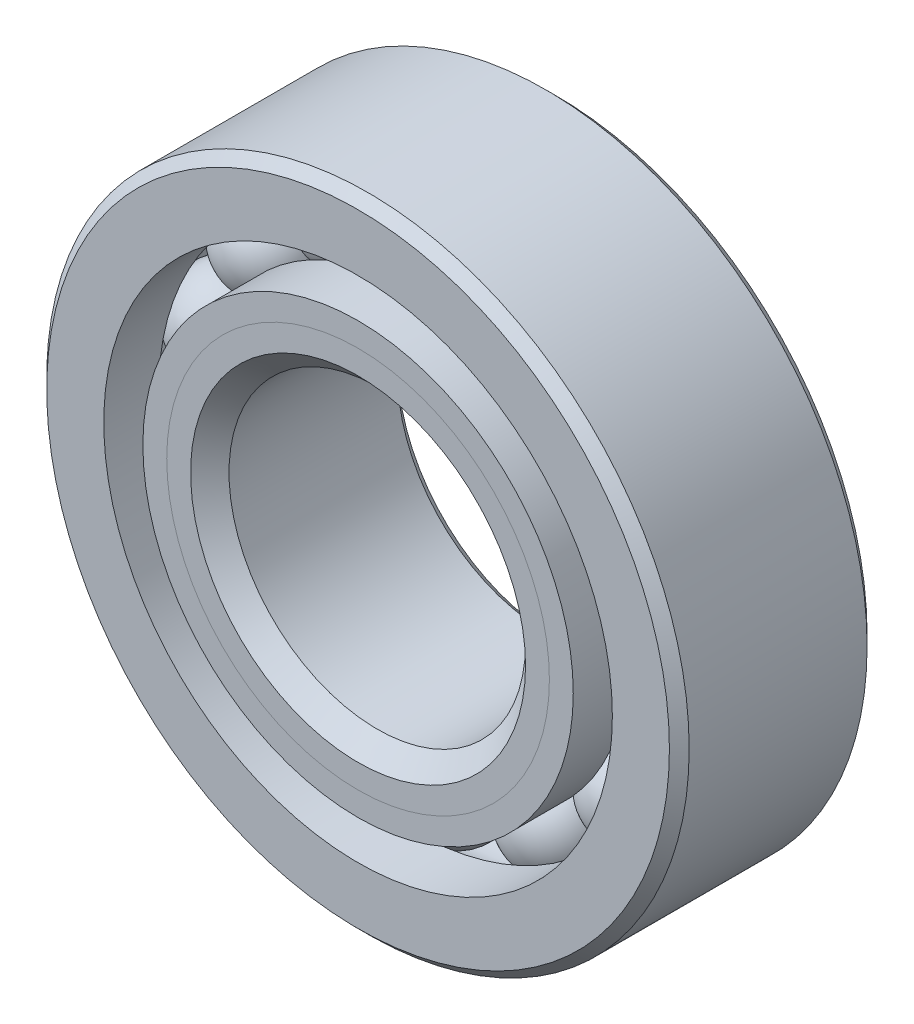
ISO-10303-21;
HEADER;
FILE_DESCRIPTION(('STEP AP214'),'2;1');
FILE_NAME('part.step','',(''),(''),'','','');
FILE_SCHEMA(('AUTOMOTIVE_DESIGN { 1 0 10303 214 1 1 1 1 }'));
ENDSEC;
DATA;
#1=APPLICATION_CONTEXT('core data for automotive mechanical design processes');
#2=APPLICATION_PROTOCOL_DEFINITION('international standard','automotive_design',2000,#1);
#3=PRODUCT_CONTEXT('',#1,'mechanical');
#4=PRODUCT('Part','Part','',(#3));
#5=PRODUCT_RELATED_PRODUCT_CATEGORY('part','',(#4));
#6=PRODUCT_DEFINITION_FORMATION('','',#4);
#7=PRODUCT_DEFINITION_CONTEXT('part definition',#1,'design');
#8=PRODUCT_DEFINITION('design','',#6,#7);
#9=PRODUCT_DEFINITION_SHAPE('','',#8);
#10=(LENGTH_UNIT() NAMED_UNIT(*) SI_UNIT(.MILLI.,.METRE.));
#11=(NAMED_UNIT(*) PLANE_ANGLE_UNIT() SI_UNIT($,.RADIAN.));
#12=(NAMED_UNIT(*) SI_UNIT($,.STERADIAN.) SOLID_ANGLE_UNIT());
#13=UNCERTAINTY_MEASURE_WITH_UNIT(LENGTH_MEASURE(1.E-05),#10,'distance_accuracy_value','');
#14=(GEOMETRIC_REPRESENTATION_CONTEXT(3) GLOBAL_UNCERTAINTY_ASSIGNED_CONTEXT((#13)) GLOBAL_UNIT_ASSIGNED_CONTEXT((#10,
#11,#12)) REPRESENTATION_CONTEXT('',''));
#15=CARTESIAN_POINT('',(0.,0.,0.));
#16=DIRECTION('',(0.,0.,1.));
#17=DIRECTION('',(1.,0.,0.));
#18=AXIS2_PLACEMENT_3D('',#15,#16,#17);
#19=CARTESIAN_POINT('',(-6.5435091405665,13.5877367390534,0.));
#20=DIRECTION('',(0.,0.,1.));
#21=DIRECTION('',(-0.433883739117546,0.900968867902425,0.));
#22=AXIS2_PLACEMENT_3D('',#19,#20,#21);
#23=SPHERICAL_SURFACE('',#22,3.08910742628344);
#24=CARTESIAN_POINT('',(-6.5435091405665,13.5877367390534,3.08910742628344));
#25=VERTEX_POINT('',#24);
#26=VERTEX_LOOP('',#25);
#27=FACE_BOUND('',#26,.T.);
#28=ADVANCED_FACE('F41',(#27),#23,.T.);
#29=CLOSED_SHELL('',(#28));
#30=MANIFOLD_SOLID_BREP('B2',#29);
#31=CARTESIAN_POINT('',(-11.7909960449709,9.40300557428217,0.));
#32=DIRECTION('',(0.,0.,1.));
#33=DIRECTION('',(-0.781831482468022,0.623489801858743,0.));
#34=AXIS2_PLACEMENT_3D('',#31,#32,#33);
#35=SPHERICAL_SURFACE('',#34,3.08910742628344);
#36=CARTESIAN_POINT('',(-11.7909960449709,9.40300557428217,3.08910742628344));
#37=VERTEX_POINT('',#36);
#38=VERTEX_LOOP('',#37);
#39=FACE_BOUND('',#38,.T.);
#40=ADVANCED_FACE('F62',(#39),#35,.T.);
#41=CLOSED_SHELL('',(#40));
#42=MANIFOLD_SOLID_BREP('B6',#41);
#43=CARTESIAN_POINT('',(-14.7031315755921,3.35589383522882,0.));
#44=DIRECTION('',(0.,0.,1.));
#45=DIRECTION('',(-0.974927912181821,0.222520933956325,0.));
#46=AXIS2_PLACEMENT_3D('',#43,#44,#45);
#47=SPHERICAL_SURFACE('',#46,3.08910742628344);
#48=CARTESIAN_POINT('',(-14.7031315755921,3.35589383522882,3.08910742628344));
#49=VERTEX_POINT('',#48);
#50=VERTEX_LOOP('',#49);
#51=FACE_BOUND('',#50,.T.);
#52=ADVANCED_FACE('F83',(#51),#47,.T.);
#53=CLOSED_SHELL('',(#52));
#54=MANIFOLD_SOLID_BREP('B37',#53);
#55=CARTESIAN_POINT('',(-14.7031315755922,-3.35589383522853,0.));
#56=DIRECTION('',(0.,0.,1.));
#57=DIRECTION('',(-0.974927912181826,-0.222520933956305,0.));
#58=AXIS2_PLACEMENT_3D('',#55,#56,#57);
#59=SPHERICAL_SURFACE('',#58,3.08910742628344);
#60=CARTESIAN_POINT('',(-14.7031315755922,-3.35589383522853,3.08910742628344));
#61=VERTEX_POINT('',#60);
#62=VERTEX_LOOP('',#61);
#63=FACE_BOUND('',#62,.T.);
#64=ADVANCED_FACE('F104',(#63),#59,.T.);
#65=CLOSED_SHELL('',(#64));
#66=MANIFOLD_SOLID_BREP('B58',#65);
#67=CARTESIAN_POINT('',(-11.7909960449711,-9.40300557428192,0.));
#68=DIRECTION('',(0.,0.,1.));
#69=DIRECTION('',(-0.781831482468035,-0.623489801858727,0.));
#70=AXIS2_PLACEMENT_3D('',#67,#68,#69);
#71=SPHERICAL_SURFACE('',#70,3.08910742628344);
#72=CARTESIAN_POINT('',(-11.7909960449711,-9.40300557428192,3.08910742628344));
#73=VERTEX_POINT('',#72);
#74=VERTEX_LOOP('',#73);
#75=FACE_BOUND('',#74,.T.);
#76=ADVANCED_FACE('F125',(#75),#71,.T.);
#77=CLOSED_SHELL('',(#76));
#78=MANIFOLD_SOLID_BREP('B79',#77);
#79=CARTESIAN_POINT('',(-6.54350914056678,-13.5877367390533,0.));
#80=DIRECTION('',(0.,0.,1.));
#81=DIRECTION('',(-0.433883739117565,-0.900968867902416,0.));
#82=AXIS2_PLACEMENT_3D('',#79,#80,#81);
#83=SPHERICAL_SURFACE('',#82,3.08910742628344);
#84=CARTESIAN_POINT('',(-6.54350914056678,-13.5877367390533,3.08910742628344));
#85=VERTEX_POINT('',#84);
#86=VERTEX_LOOP('',#85);
#87=FACE_BOUND('',#86,.T.);
#88=ADVANCED_FACE('F146',(#87),#83,.T.);
#89=CLOSED_SHELL('',(#88));
#90=MANIFOLD_SOLID_BREP('B100',#89);
#91=CARTESIAN_POINT('',(-1.05311866879462E-13,-15.08125,0.));
#92=DIRECTION('',(0.,0.,1.));
#93=DIRECTION('',(0.,-1.,0.));
#94=AXIS2_PLACEMENT_3D('',#91,#92,#93);
#95=SPHERICAL_SURFACE('',#94,3.08910742628344);
#96=CARTESIAN_POINT('',(-1.05311866879462E-13,-15.08125,3.08910742628344));
#97=VERTEX_POINT('',#96);
#98=VERTEX_LOOP('',#97);
#99=FACE_BOUND('',#98,.T.);
#100=ADVANCED_FACE('F167',(#99),#95,.T.);
#101=CLOSED_SHELL('',(#100));
#102=MANIFOLD_SOLID_BREP('B121',#101);
#103=CARTESIAN_POINT('',(6.54350914056659,-13.5877367390534,0.));
#104=DIRECTION('',(0.,0.,1.));
#105=DIRECTION('',(0.433883739117553,-0.900968867902422,0.));
#106=AXIS2_PLACEMENT_3D('',#103,#104,#105);
#107=SPHERICAL_SURFACE('',#106,3.08910742628344);
#108=CARTESIAN_POINT('',(6.54350914056659,-13.5877367390534,3.08910742628344));
#109=VERTEX_POINT('',#108);
#110=VERTEX_LOOP('',#109);
#111=FACE_BOUND('',#110,.T.);
#112=ADVANCED_FACE('F188',(#111),#107,.T.);
#113=CLOSED_SHELL('',(#112));
#114=MANIFOLD_SOLID_BREP('B142',#113);
#115=CARTESIAN_POINT('',(11.7909960449709,-9.40300557428208,0.));
#116=DIRECTION('',(0.,0.,1.));
#117=DIRECTION('',(0.781831482468027,-0.623489801858737,0.));
#118=AXIS2_PLACEMENT_3D('',#115,#116,#117);
#119=SPHERICAL_SURFACE('',#118,3.08910742628344);
#120=CARTESIAN_POINT('',(11.7909960449709,-9.40300557428208,3.08910742628344));
#121=VERTEX_POINT('',#120);
#122=VERTEX_LOOP('',#121);
#123=FACE_BOUND('',#122,.T.);
#124=ADVANCED_FACE('F209',(#123),#119,.T.);
#125=CLOSED_SHELL('',(#124));
#126=MANIFOLD_SOLID_BREP('B163',#125);
#127=CARTESIAN_POINT('',(14.7031315755921,-3.35589383522872,0.));
#128=DIRECTION('',(0.,0.,1.));
#129=DIRECTION('',(0.974927912181823,-0.222520933956318,0.));
#130=AXIS2_PLACEMENT_3D('',#127,#128,#129);
#131=SPHERICAL_SURFACE('',#130,3.08910742628344);
#132=CARTESIAN_POINT('',(14.7031315755921,-3.35589383522872,3.08910742628344));
#133=VERTEX_POINT('',#132);
#134=VERTEX_LOOP('',#133);
#135=FACE_BOUND('',#134,.T.);
#136=ADVANCED_FACE('F230',(#135),#131,.T.);
#137=CLOSED_SHELL('',(#136));
#138=MANIFOLD_SOLID_BREP('B184',#137);
#139=CARTESIAN_POINT('',(14.7031315755921,3.35589383522862,0.));
#140=DIRECTION('',(0.,0.,1.));
#141=DIRECTION('',(0.974927912181824,0.222520933956311,0.));
#142=AXIS2_PLACEMENT_3D('',#139,#140,#141);
#143=SPHERICAL_SURFACE('',#142,3.08910742628344);
#144=CARTESIAN_POINT('',(14.7031315755921,3.35589383522862,3.08910742628344));
#145=VERTEX_POINT('',#144);
#146=VERTEX_LOOP('',#145);
#147=FACE_BOUND('',#146,.T.);
#148=ADVANCED_FACE('F251',(#147),#143,.T.);
#149=CLOSED_SHELL('',(#148));
#150=MANIFOLD_SOLID_BREP('B205',#149);
#151=CARTESIAN_POINT('',(11.790996044971,9.403005574282,0.));
#152=DIRECTION('',(0.,0.,1.));
#153=DIRECTION('',(0.781831482468031,0.623489801858732,0.));
#154=AXIS2_PLACEMENT_3D('',#151,#152,#153);
#155=SPHERICAL_SURFACE('',#154,3.08910742628344);
#156=CARTESIAN_POINT('',(11.790996044971,9.403005574282,3.08910742628344));
#157=VERTEX_POINT('',#156);
#158=VERTEX_LOOP('',#157);
#159=FACE_BOUND('',#158,.T.);
#160=ADVANCED_FACE('F272',(#159),#155,.T.);
#161=CLOSED_SHELL('',(#160));
#162=MANIFOLD_SOLID_BREP('B226',#161);
#163=CARTESIAN_POINT('',(6.54350914056669,13.5877367390534,0.));
#164=DIRECTION('',(0.,0.,1.));
#165=DIRECTION('',(0.433883739117559,0.900968867902419,0.));
#166=AXIS2_PLACEMENT_3D('',#163,#164,#165);
#167=SPHERICAL_SURFACE('',#166,3.08910742628344);
#168=CARTESIAN_POINT('',(6.54350914056669,13.5877367390534,3.08910742628344));
#169=VERTEX_POINT('',#168);
#170=VERTEX_LOOP('',#169);
#171=FACE_BOUND('',#170,.T.);
#172=ADVANCED_FACE('F293',(#171),#167,.T.);
#173=CLOSED_SHELL('',(#172));
#174=MANIFOLD_SOLID_BREP('B247',#173);
#175=CARTESIAN_POINT('',(0.,15.08125,0.));
#176=DIRECTION('',(0.,0.,1.));
#177=DIRECTION('',(0.,1.,0.));
#178=AXIS2_PLACEMENT_3D('',#175,#176,#177);
#179=SPHERICAL_SURFACE('',#178,3.08910742628344);
#180=CARTESIAN_POINT('',(0.,15.08125,3.08910742628344));
#181=VERTEX_POINT('',#180);
#182=VERTEX_LOOP('',#181);
#183=FACE_BOUND('',#182,.T.);
#184=ADVANCED_FACE('F315',(#183),#179,.T.);
#185=CLOSED_SHELL('',(#184));
#186=MANIFOLD_SOLID_BREP('B268',#185);
#187=CARTESIAN_POINT('',(0.,12.2918886654072,6.35));
#188=DIRECTION('',(0.,0.,-1.));
#189=DIRECTION('',(-1.,0.,0.));
#190=AXIS2_PLACEMENT_3D('',#187,#188,#189);
#191=PLANE('',#190);
#192=CARTESIAN_POINT('',(0.,0.,6.35));
#193=DIRECTION('',(0.,0.,1.));
#194=DIRECTION('',(1.,0.,0.));
#195=AXIS2_PLACEMENT_3D('',#192,#193,#194);
#196=CIRCLE('',#195,10.7585712868583);
#197=CARTESIAN_POINT('',(10.7585712868583,0.,6.35));
#198=VERTEX_POINT('',#197);
#199=EDGE_CURVE('E370',#198,#198,#196,.T.);
#200=ORIENTED_EDGE('',*,*,#199,.F.);
#201=EDGE_LOOP('',(#200));
#202=FACE_BOUND('',#201,.T.);
#203=CARTESIAN_POINT('',(0.,0.,6.35));
#204=DIRECTION('',(0.,0.,1.));
#205=DIRECTION('',(1.,0.,0.));
#206=AXIS2_PLACEMENT_3D('',#203,#204,#205);
#207=CIRCLE('',#206,12.2918886654072);
#208=CARTESIAN_POINT('',(12.2918886654072,0.,6.35));
#209=VERTEX_POINT('',#208);
#210=EDGE_CURVE('E314',#209,#209,#207,.T.);
#211=ORIENTED_EDGE('',*,*,#210,.T.);
#212=EDGE_LOOP('',(#211));
#213=FACE_BOUND('',#212,.T.);
#214=ADVANCED_FACE('F336',(#202,#213),#191,.F.);
#215=CARTESIAN_POINT('',(0.,0.,4.81668262145113));
#216=DIRECTION('',(0.,0.,1.));
#217=DIRECTION('',(1.,0.,0.));
#218=AXIS2_PLACEMENT_3D('',#215,#216,#217);
#219=CONICAL_SURFACE('',#218,10.7585712868583,0.785398163397451);
#220=ORIENTED_EDGE('',*,*,#210,.F.);
#221=EDGE_LOOP('',(#220));
#222=FACE_BOUND('',#221,.T.);
#223=CARTESIAN_POINT('',(0.,0.,4.81668262145113));
#224=DIRECTION('',(0.,0.,1.));
#225=DIRECTION('',(1.,0.,0.));
#226=AXIS2_PLACEMENT_3D('',#223,#224,#225);
#227=CIRCLE('',#226,10.7585712868583);
#228=CARTESIAN_POINT('',(10.7585712868583,0.,4.81668262145113));
#229=VERTEX_POINT('',#228);
#230=EDGE_CURVE('E342',#229,#229,#227,.T.);
#231=ORIENTED_EDGE('',*,*,#230,.T.);
#232=EDGE_LOOP('',(#231));
#233=FACE_BOUND('',#232,.T.);
#234=ADVANCED_FACE('F377',(#222,#233),#219,.T.);
#235=CARTESIAN_POINT('',(0.,0.,6.35));
#236=DIRECTION('',(0.,0.,1.));
#237=DIRECTION('',(1.,0.,0.));
#238=AXIS2_PLACEMENT_3D('',#235,#236,#237);
#239=CYLINDRICAL_SURFACE('',#238,10.7585712868583);
#240=ORIENTED_EDGE('',*,*,#230,.F.);
#241=EDGE_LOOP('',(#240));
#242=FACE_BOUND('',#241,.T.);
#243=CARTESIAN_POINT('',(0.,0.,0.));
#244=DIRECTION('',(0.,0.,1.));
#245=DIRECTION('',(1.,0.,0.));
#246=AXIS2_PLACEMENT_3D('',#243,#244,#245);
#247=CIRCLE('',#246,10.7585712868583);
#248=CARTESIAN_POINT('',(10.7585712868583,0.,0.));
#249=VERTEX_POINT('',#248);
#250=EDGE_CURVE('E346',#249,#249,#247,.T.);
#251=ORIENTED_EDGE('',*,*,#250,.T.);
#252=EDGE_LOOP('',(#251));
#253=FACE_BOUND('',#252,.T.);
#254=ADVANCED_FACE('F381',(#242,#253),#239,.T.);
#255=CARTESIAN_POINT('',(0.,10.7585712868583,0.));
#256=DIRECTION('',(0.,0.,-1.));
#257=DIRECTION('',(-1.,0.,0.));
#258=AXIS2_PLACEMENT_3D('',#255,#256,#257);
#259=PLANE('',#258);
#260=ORIENTED_EDGE('',*,*,#250,.F.);
#261=EDGE_LOOP('',(#260));
#262=FACE_BOUND('',#261,.T.);
#263=CARTESIAN_POINT('',(0.,0.,0.));
#264=DIRECTION('',(0.,0.,1.));
#265=DIRECTION('',(1.,0.,0.));
#266=AXIS2_PLACEMENT_3D('',#263,#264,#265);
#267=CIRCLE('',#266,11.9921425737166);
#268=CARTESIAN_POINT('',(11.9921425737166,0.,0.));
#269=VERTEX_POINT('',#268);
#270=EDGE_CURVE('E350',#269,#269,#267,.T.);
#271=ORIENTED_EDGE('',*,*,#270,.T.);
#272=EDGE_LOOP('',(#271));
#273=FACE_BOUND('',#272,.T.);
#274=ADVANCED_FACE('F386',(#262,#273),#259,.F.);
#275=CARTESIAN_POINT('',(0.,0.,0.));
#276=DIRECTION('',(0.,0.,1.));
#277=DIRECTION('',(1.,0.,0.));
#278=AXIS2_PLACEMENT_3D('',#275,#276,#277);
#279=TOROIDAL_SURFACE('',#278,15.08125,3.08910742628344);
#280=ORIENTED_EDGE('',*,*,#270,.F.);
#281=EDGE_LOOP('',(#280));
#282=FACE_BOUND('',#281,.T.);
#283=CARTESIAN_POINT('',(0.,0.,-2.82222222222222));
#284=DIRECTION('',(0.,0.,1.));
#285=DIRECTION('',(1.,0.,0.));
#286=AXIS2_PLACEMENT_3D('',#283,#284,#285);
#287=CIRCLE('',#286,13.825206043956);
#288=CARTESIAN_POINT('',(13.825206043956,0.,-2.82222222222222));
#289=VERTEX_POINT('',#288);
#290=EDGE_CURVE('E355',#289,#289,#287,.T.);
#291=ORIENTED_EDGE('',*,*,#290,.T.);
#292=EDGE_LOOP('',(#291));
#293=FACE_BOUND('',#292,.T.);
#294=ADVANCED_FACE('F392',(#282,#293),#279,.F.);
#295=CARTESIAN_POINT('',(0.,0.,6.35));
#296=DIRECTION('',(0.,0.,1.));
#297=DIRECTION('',(1.,0.,0.));
#298=AXIS2_PLACEMENT_3D('',#295,#296,#297);
#299=CYLINDRICAL_SURFACE('',#298,13.825206043956);
#300=ORIENTED_EDGE('',*,*,#290,.F.);
#301=EDGE_LOOP('',(#300));
#302=FACE_BOUND('',#301,.T.);
#303=CARTESIAN_POINT('',(0.,0.,-6.35));
#304=DIRECTION('',(0.,0.,1.));
#305=DIRECTION('',(1.,0.,0.));
#306=AXIS2_PLACEMENT_3D('',#303,#304,#305);
#307=CIRCLE('',#306,13.825206043956);
#308=CARTESIAN_POINT('',(13.825206043956,0.,-6.35));
#309=VERTEX_POINT('',#308);
#310=EDGE_CURVE('E358',#309,#309,#307,.T.);
#311=ORIENTED_EDGE('',*,*,#310,.T.);
#312=EDGE_LOOP('',(#311));
#313=FACE_BOUND('',#312,.T.);
#314=ADVANCED_FACE('F396',(#302,#313),#299,.T.);
#315=CARTESIAN_POINT('',(0.,10.16,-6.35));
#316=DIRECTION('',(0.,0.,1.));
#317=DIRECTION('',(1.,0.,0.));
#318=AXIS2_PLACEMENT_3D('',#315,#316,#317);
#319=PLANE('',#318);
#320=ORIENTED_EDGE('',*,*,#310,.F.);
#321=EDGE_LOOP('',(#320));
#322=FACE_BOUND('',#321,.T.);
#323=CARTESIAN_POINT('',(0.,0.,-6.35));
#324=DIRECTION('',(0.,0.,1.));
#325=DIRECTION('',(1.,0.,0.));
#326=AXIS2_PLACEMENT_3D('',#323,#324,#325);
#327=CIRCLE('',#326,10.16);
#328=CARTESIAN_POINT('',(10.16,0.,-6.35));
#329=VERTEX_POINT('',#328);
#330=EDGE_CURVE('E361',#329,#329,#327,.T.);
#331=ORIENTED_EDGE('',*,*,#330,.T.);
#332=EDGE_LOOP('',(#331));
#333=FACE_BOUND('',#332,.T.);
#334=ADVANCED_FACE('F400',(#322,#333),#319,.F.);
#335=CARTESIAN_POINT('',(0.,0.,-5.715));
#336=DIRECTION('',(0.,0.,-1.));
#337=DIRECTION('',(-1.,0.,0.));
#338=AXIS2_PLACEMENT_3D('',#335,#336,#337);
#339=CONICAL_SURFACE('',#338,9.525,0.78539816339745);
#340=ORIENTED_EDGE('',*,*,#330,.F.);
#341=EDGE_LOOP('',(#340));
#342=FACE_BOUND('',#341,.T.);
#343=CARTESIAN_POINT('',(0.,0.,-5.715));
#344=DIRECTION('',(0.,0.,1.));
#345=DIRECTION('',(1.,0.,0.));
#346=AXIS2_PLACEMENT_3D('',#343,#344,#345);
#347=CIRCLE('',#346,9.525);
#348=CARTESIAN_POINT('',(9.525,0.,-5.715));
#349=VERTEX_POINT('',#348);
#350=EDGE_CURVE('E364',#349,#349,#347,.T.);
#351=ORIENTED_EDGE('',*,*,#350,.T.);
#352=EDGE_LOOP('',(#351));
#353=FACE_BOUND('',#352,.T.);
#354=ADVANCED_FACE('F404',(#342,#353),#339,.F.);
#355=CARTESIAN_POINT('',(0.,0.,6.35));
#356=DIRECTION('',(0.,0.,1.));
#357=DIRECTION('',(1.,0.,0.));
#358=AXIS2_PLACEMENT_3D('',#355,#356,#357);
#359=CYLINDRICAL_SURFACE('',#358,9.525);
#360=ORIENTED_EDGE('',*,*,#350,.F.);
#361=EDGE_LOOP('',(#360));
#362=FACE_BOUND('',#361,.T.);
#363=CARTESIAN_POINT('',(0.,0.,5.11642871314173));
#364=DIRECTION('',(0.,0.,1.));
#365=DIRECTION('',(1.,0.,0.));
#366=AXIS2_PLACEMENT_3D('',#363,#364,#365);
#367=CIRCLE('',#366,9.525);
#368=CARTESIAN_POINT('',(9.525,0.,5.11642871314173));
#369=VERTEX_POINT('',#368);
#370=EDGE_CURVE('E367',#369,#369,#367,.T.);
#371=ORIENTED_EDGE('',*,*,#370,.T.);
#372=EDGE_LOOP('',(#371));
#373=FACE_BOUND('',#372,.T.);
#374=ADVANCED_FACE('F408',(#362,#373),#359,.F.);
#375=CARTESIAN_POINT('',(0.,0.,6.35));
#376=DIRECTION('',(0.,0.,1.));
#377=DIRECTION('',(1.,0.,0.));
#378=AXIS2_PLACEMENT_3D('',#375,#376,#377);
#379=CONICAL_SURFACE('',#378,10.7585712868583,0.78539816339745);
#380=ORIENTED_EDGE('',*,*,#370,.F.);
#381=EDGE_LOOP('',(#380));
#382=FACE_BOUND('',#381,.T.);
#383=ORIENTED_EDGE('',*,*,#199,.T.);
#384=EDGE_LOOP('',(#383));
#385=FACE_BOUND('',#384,.T.);
#386=ADVANCED_FACE('F374',(#382,#385),#379,.F.);
#387=CLOSED_SHELL('',(#214,#234,#254,#274,#294,#314,#334,#354,#374,#386));
#388=MANIFOLD_SOLID_BREP('B289',#387);
#389=CARTESIAN_POINT('',(0.,13.825206043956,6.35));
#390=DIRECTION('',(0.,0.,-1.));
#391=DIRECTION('',(-1.,0.,0.));
#392=AXIS2_PLACEMENT_3D('',#389,#390,#391);
#393=PLANE('',#392);
#394=CARTESIAN_POINT('',(0.,0.,6.35));
#395=DIRECTION('',(0.,0.,1.));
#396=DIRECTION('',(1.,0.,0.));
#397=AXIS2_PLACEMENT_3D('',#394,#395,#396);
#398=CIRCLE('',#397,12.2918886654072);
#399=CARTESIAN_POINT('',(12.2918886654072,0.,6.35));
#400=VERTEX_POINT('',#399);
#401=EDGE_CURVE('E335',#400,#400,#398,.T.);
#402=ORIENTED_EDGE('',*,*,#401,.F.);
#403=EDGE_LOOP('',(#402));
#404=FACE_BOUND('',#403,.T.);
#405=CARTESIAN_POINT('',(0.,0.,6.35));
#406=DIRECTION('',(0.,0.,1.));
#407=DIRECTION('',(1.,0.,0.));
#408=AXIS2_PLACEMENT_3D('',#405,#406,#407);
#409=CIRCLE('',#408,13.825206043956);
#410=CARTESIAN_POINT('',(13.825206043956,0.,6.35));
#411=VERTEX_POINT('',#410);
#412=EDGE_CURVE('E517',#411,#411,#409,.T.);
#413=ORIENTED_EDGE('',*,*,#412,.T.);
#414=EDGE_LOOP('',(#413));
#415=FACE_BOUND('',#414,.T.);
#416=ADVANCED_FACE('F495',(#404,#415),#393,.F.);
#417=CARTESIAN_POINT('',(0.,0.,6.35));
#418=DIRECTION('',(0.,0.,1.));
#419=DIRECTION('',(1.,0.,0.));
#420=AXIS2_PLACEMENT_3D('',#417,#418,#419);
#421=CONICAL_SURFACE('',#420,12.2918886654072,0.785398163397451);
#422=CARTESIAN_POINT('',(0.,0.,4.81668262145113));
#423=DIRECTION('',(0.,0.,1.));
#424=DIRECTION('',(1.,0.,0.));
#425=AXIS2_PLACEMENT_3D('',#422,#423,#424);
#426=CIRCLE('',#425,10.7585712868583);
#427=CARTESIAN_POINT('',(10.7585712868583,0.,4.81668262145113));
#428=VERTEX_POINT('',#427);
#429=EDGE_CURVE('E501',#428,#428,#426,.T.);
#430=ORIENTED_EDGE('',*,*,#429,.F.);
#431=EDGE_LOOP('',(#430));
#432=FACE_BOUND('',#431,.T.);
#433=ORIENTED_EDGE('',*,*,#401,.T.);
#434=EDGE_LOOP('',(#433));
#435=FACE_BOUND('',#434,.T.);
#436=ADVANCED_FACE('F542',(#432,#435),#421,.F.);
#437=CARTESIAN_POINT('',(0.,0.,6.35));
#438=DIRECTION('',(0.,0.,1.));
#439=DIRECTION('',(1.,0.,0.));
#440=AXIS2_PLACEMENT_3D('',#437,#438,#439);
#441=CYLINDRICAL_SURFACE('',#440,10.7585712868583);
#442=CARTESIAN_POINT('',(0.,0.,0.));
#443=DIRECTION('',(0.,0.,1.));
#444=DIRECTION('',(1.,0.,0.));
#445=AXIS2_PLACEMENT_3D('',#442,#443,#444);
#446=CIRCLE('',#445,10.7585712868583);
#447=CARTESIAN_POINT('',(10.7585712868583,0.,0.));
#448=VERTEX_POINT('',#447);
#449=EDGE_CURVE('E505',#448,#448,#446,.T.);
#450=ORIENTED_EDGE('',*,*,#449,.F.);
#451=EDGE_LOOP('',(#450));
#452=FACE_BOUND('',#451,.T.);
#453=ORIENTED_EDGE('',*,*,#429,.T.);
#454=EDGE_LOOP('',(#453));
#455=FACE_BOUND('',#454,.T.);
#456=ADVANCED_FACE('F537',(#452,#455),#441,.F.);
#457=CARTESIAN_POINT('',(0.,10.7585712868583,0.));
#458=DIRECTION('',(0.,0.,1.));
#459=DIRECTION('',(1.,0.,0.));
#460=AXIS2_PLACEMENT_3D('',#457,#458,#459);
#461=PLANE('',#460);
#462=CARTESIAN_POINT('',(0.,0.,0.));
#463=DIRECTION('',(0.,0.,1.));
#464=DIRECTION('',(1.,0.,0.));
#465=AXIS2_PLACEMENT_3D('',#462,#463,#464);
#466=CIRCLE('',#465,11.9921425737166);
#467=CARTESIAN_POINT('',(11.9921425737166,0.,0.));
#468=VERTEX_POINT('',#467);
#469=EDGE_CURVE('E509',#468,#468,#466,.T.);
#470=ORIENTED_EDGE('',*,*,#469,.F.);
#471=EDGE_LOOP('',(#470));
#472=FACE_BOUND('',#471,.T.);
#473=ORIENTED_EDGE('',*,*,#449,.T.);
#474=EDGE_LOOP('',(#473));
#475=FACE_BOUND('',#474,.T.);
#476=ADVANCED_FACE('F531',(#472,#475),#461,.F.);
#477=CARTESIAN_POINT('',(0.,0.,0.));
#478=DIRECTION('',(0.,0.,1.));
#479=DIRECTION('',(1.,0.,0.));
#480=AXIS2_PLACEMENT_3D('',#477,#478,#479);
#481=TOROIDAL_SURFACE('',#480,15.08125,3.08910742628344);
#482=CARTESIAN_POINT('',(0.,0.,2.82222222222222));
#483=DIRECTION('',(0.,0.,1.));
#484=DIRECTION('',(1.,0.,0.));
#485=AXIS2_PLACEMENT_3D('',#482,#483,#484);
#486=CIRCLE('',#485,13.825206043956);
#487=CARTESIAN_POINT('',(13.825206043956,0.,2.82222222222222));
#488=VERTEX_POINT('',#487);
#489=EDGE_CURVE('E514',#488,#488,#486,.T.);
#490=ORIENTED_EDGE('',*,*,#489,.F.);
#491=EDGE_LOOP('',(#490));
#492=FACE_BOUND('',#491,.T.);
#493=ORIENTED_EDGE('',*,*,#469,.T.);
#494=EDGE_LOOP('',(#493));
#495=FACE_BOUND('',#494,.T.);
#496=ADVANCED_FACE('F525',(#492,#495),#481,.F.);
#497=CARTESIAN_POINT('',(0.,0.,6.35));
#498=DIRECTION('',(0.,0.,1.));
#499=DIRECTION('',(1.,0.,0.));
#500=AXIS2_PLACEMENT_3D('',#497,#498,#499);
#501=CYLINDRICAL_SURFACE('',#500,13.825206043956);
#502=ORIENTED_EDGE('',*,*,#412,.F.);
#503=EDGE_LOOP('',(#502));
#504=FACE_BOUND('',#503,.T.);
#505=ORIENTED_EDGE('',*,*,#489,.T.);
#506=EDGE_LOOP('',(#505));
#507=FACE_BOUND('',#506,.T.);
#508=ADVANCED_FACE('F522',(#504,#507),#501,.T.);
#509=CLOSED_SHELL('',(#416,#436,#456,#476,#496,#508));
#510=MANIFOLD_SOLID_BREP('B309',#509);
#511=CARTESIAN_POINT('',(0.,0.,5.715));
#512=DIRECTION('',(0.,0.,-1.));
#513=DIRECTION('',(-1.,0.,0.));
#514=AXIS2_PLACEMENT_3D('',#511,#512,#513);
#515=CONICAL_SURFACE('',#514,20.6375,0.785398163397446);
#516=CARTESIAN_POINT('',(0.,0.,6.35));
#517=DIRECTION('',(0.,0.,1.));
#518=DIRECTION('',(1.,0.,0.));
#519=AXIS2_PLACEMENT_3D('',#516,#517,#518);
#520=CIRCLE('',#519,20.0025);
#521=CARTESIAN_POINT('',(20.0025,0.,6.35));
#522=VERTEX_POINT('',#521);
#523=EDGE_CURVE('E615',#522,#522,#520,.T.);
#524=ORIENTED_EDGE('',*,*,#523,.F.);
#525=EDGE_LOOP('',(#524));
#526=FACE_BOUND('',#525,.T.);
#527=CARTESIAN_POINT('',(0.,0.,5.715));
#528=DIRECTION('',(0.,0.,1.));
#529=DIRECTION('',(1.,0.,0.));
#530=AXIS2_PLACEMENT_3D('',#527,#528,#529);
#531=CIRCLE('',#530,20.6375);
#532=CARTESIAN_POINT('',(20.6375,0.,5.715));
#533=VERTEX_POINT('',#532);
#534=EDGE_CURVE('E494',#533,#533,#531,.T.);
#535=ORIENTED_EDGE('',*,*,#534,.T.);
#536=EDGE_LOOP('',(#535));
#537=FACE_BOUND('',#536,.T.);
#538=ADVANCED_FACE('F587',(#526,#537),#515,.T.);
#539=CARTESIAN_POINT('',(0.,0.,6.35));
#540=DIRECTION('',(0.,0.,1.));
#541=DIRECTION('',(1.,0.,0.));
#542=AXIS2_PLACEMENT_3D('',#539,#540,#541);
#543=CYLINDRICAL_SURFACE('',#542,20.6375);
#544=ORIENTED_EDGE('',*,*,#534,.F.);
#545=EDGE_LOOP('',(#544));
#546=FACE_BOUND('',#545,.T.);
#547=CARTESIAN_POINT('',(0.,0.,-5.715));
#548=DIRECTION('',(0.,0.,1.));
#549=DIRECTION('',(1.,0.,0.));
#550=AXIS2_PLACEMENT_3D('',#547,#548,#549);
#551=CIRCLE('',#550,20.6375);
#552=CARTESIAN_POINT('',(20.6375,0.,-5.715));
#553=VERTEX_POINT('',#552);
#554=EDGE_CURVE('E593',#553,#553,#551,.T.);
#555=ORIENTED_EDGE('',*,*,#554,.T.);
#556=EDGE_LOOP('',(#555));
#557=FACE_BOUND('',#556,.T.);
#558=ADVANCED_FACE('F622',(#546,#557),#543,.T.);
#559=CARTESIAN_POINT('',(0.,0.,-6.35));
#560=DIRECTION('',(0.,0.,1.));
#561=DIRECTION('',(1.,0.,0.));
#562=AXIS2_PLACEMENT_3D('',#559,#560,#561);
#563=CONICAL_SURFACE('',#562,20.0025,0.785398163397446);
#564=ORIENTED_EDGE('',*,*,#554,.F.);
#565=EDGE_LOOP('',(#564));
#566=FACE_BOUND('',#565,.T.);
#567=CARTESIAN_POINT('',(0.,0.,-6.35));
#568=DIRECTION('',(0.,0.,1.));
#569=DIRECTION('',(1.,0.,0.));
#570=AXIS2_PLACEMENT_3D('',#567,#568,#569);
#571=CIRCLE('',#570,20.0025);
#572=CARTESIAN_POINT('',(20.0025,0.,-6.35));
#573=VERTEX_POINT('',#572);
#574=EDGE_CURVE('E597',#573,#573,#571,.T.);
#575=ORIENTED_EDGE('',*,*,#574,.T.);
#576=EDGE_LOOP('',(#575));
#577=FACE_BOUND('',#576,.T.);
#578=ADVANCED_FACE('F626',(#566,#577),#563,.T.);
#579=CARTESIAN_POINT('',(0.,20.0025,-6.35));
#580=DIRECTION('',(0.,0.,1.));
#581=DIRECTION('',(1.,0.,0.));
#582=AXIS2_PLACEMENT_3D('',#579,#580,#581);
#583=PLANE('',#582);
#584=ORIENTED_EDGE('',*,*,#574,.F.);
#585=EDGE_LOOP('',(#584));
#586=FACE_BOUND('',#585,.T.);
#587=CARTESIAN_POINT('',(0.,0.,-6.35));
#588=DIRECTION('',(0.,0.,1.));
#589=DIRECTION('',(1.,0.,0.));
#590=AXIS2_PLACEMENT_3D('',#587,#588,#589);
#591=CIRCLE('',#590,16.337293956044);
#592=CARTESIAN_POINT('',(16.337293956044,0.,-6.35));
#593=VERTEX_POINT('',#592);
#594=EDGE_CURVE('E601',#593,#593,#591,.T.);
#595=ORIENTED_EDGE('',*,*,#594,.T.);
#596=EDGE_LOOP('',(#595));
#597=FACE_BOUND('',#596,.T.);
#598=ADVANCED_FACE('F631',(#586,#597),#583,.F.);
#599=CARTESIAN_POINT('',(0.,0.,6.35));
#600=DIRECTION('',(0.,0.,1.));
#601=DIRECTION('',(1.,0.,0.));
#602=AXIS2_PLACEMENT_3D('',#599,#600,#601);
#603=CYLINDRICAL_SURFACE('',#602,16.337293956044);
#604=ORIENTED_EDGE('',*,*,#594,.F.);
#605=EDGE_LOOP('',(#604));
#606=FACE_BOUND('',#605,.T.);
#607=CARTESIAN_POINT('',(0.,0.,-2.82222222222222));
#608=DIRECTION('',(0.,0.,1.));
#609=DIRECTION('',(1.,0.,0.));
#610=AXIS2_PLACEMENT_3D('',#607,#608,#609);
#611=CIRCLE('',#610,16.337293956044);
#612=CARTESIAN_POINT('',(16.337293956044,0.,-2.82222222222222));
#613=VERTEX_POINT('',#612);
#614=EDGE_CURVE('E606',#613,#613,#611,.T.);
#615=ORIENTED_EDGE('',*,*,#614,.T.);
#616=EDGE_LOOP('',(#615));
#617=FACE_BOUND('',#616,.T.);
#618=ADVANCED_FACE('F637',(#606,#617),#603,.F.);
#619=CARTESIAN_POINT('',(0.,0.,0.));
#620=DIRECTION('',(0.,0.,1.));
#621=DIRECTION('',(1.,0.,0.));
#622=AXIS2_PLACEMENT_3D('',#619,#620,#621);
#623=TOROIDAL_SURFACE('',#622,15.08125,3.08910742628344);
#624=ORIENTED_EDGE('',*,*,#614,.F.);
#625=EDGE_LOOP('',(#624));
#626=FACE_BOUND('',#625,.T.);
#627=CARTESIAN_POINT('',(0.,0.,2.82222222222222));
#628=DIRECTION('',(0.,0.,1.));
#629=DIRECTION('',(1.,0.,0.));
#630=AXIS2_PLACEMENT_3D('',#627,#628,#629);
#631=CIRCLE('',#630,16.337293956044);
#632=CARTESIAN_POINT('',(16.337293956044,0.,2.82222222222222));
#633=VERTEX_POINT('',#632);
#634=EDGE_CURVE('E609',#633,#633,#631,.T.);
#635=ORIENTED_EDGE('',*,*,#634,.T.);
#636=EDGE_LOOP('',(#635));
#637=FACE_BOUND('',#636,.T.);
#638=ADVANCED_FACE('F641',(#626,#637),#623,.F.);
#639=CARTESIAN_POINT('',(0.,0.,6.35));
#640=DIRECTION('',(0.,0.,1.));
#641=DIRECTION('',(1.,0.,0.));
#642=AXIS2_PLACEMENT_3D('',#639,#640,#641);
#643=CYLINDRICAL_SURFACE('',#642,16.337293956044);
#644=ORIENTED_EDGE('',*,*,#634,.F.);
#645=EDGE_LOOP('',(#644));
#646=FACE_BOUND('',#645,.T.);
#647=CARTESIAN_POINT('',(0.,0.,6.35));
#648=DIRECTION('',(0.,0.,1.));
#649=DIRECTION('',(1.,0.,0.));
#650=AXIS2_PLACEMENT_3D('',#647,#648,#649);
#651=CIRCLE('',#650,16.337293956044);
#652=CARTESIAN_POINT('',(16.337293956044,0.,6.35));
#653=VERTEX_POINT('',#652);
#654=EDGE_CURVE('E612',#653,#653,#651,.T.);
#655=ORIENTED_EDGE('',*,*,#654,.T.);
#656=EDGE_LOOP('',(#655));
#657=FACE_BOUND('',#656,.T.);
#658=ADVANCED_FACE('F645',(#646,#657),#643,.F.);
#659=CARTESIAN_POINT('',(0.,20.0025,6.35));
#660=DIRECTION('',(0.,0.,-1.));
#661=DIRECTION('',(-1.,0.,0.));
#662=AXIS2_PLACEMENT_3D('',#659,#660,#661);
#663=PLANE('',#662);
#664=ORIENTED_EDGE('',*,*,#654,.F.);
#665=EDGE_LOOP('',(#664));
#666=FACE_BOUND('',#665,.T.);
#667=ORIENTED_EDGE('',*,*,#523,.T.);
#668=EDGE_LOOP('',(#667));
#669=FACE_BOUND('',#668,.T.);
#670=ADVANCED_FACE('F619',(#666,#669),#663,.F.);
#671=CLOSED_SHELL('',(#538,#558,#578,#598,#618,#638,#658,#670));
#672=MANIFOLD_SOLID_BREP('B330',#671);
#673=ADVANCED_BREP_SHAPE_REPRESENTATION('',(#18,#30,#42,#54,#66,#78,#90,#102,#114,#126,#138,
#150,#162,#174,#186,#388,#510,#672),#14);
#674=SHAPE_DEFINITION_REPRESENTATION(#9,#673);
ENDSEC;
END-ISO-10303-21;
